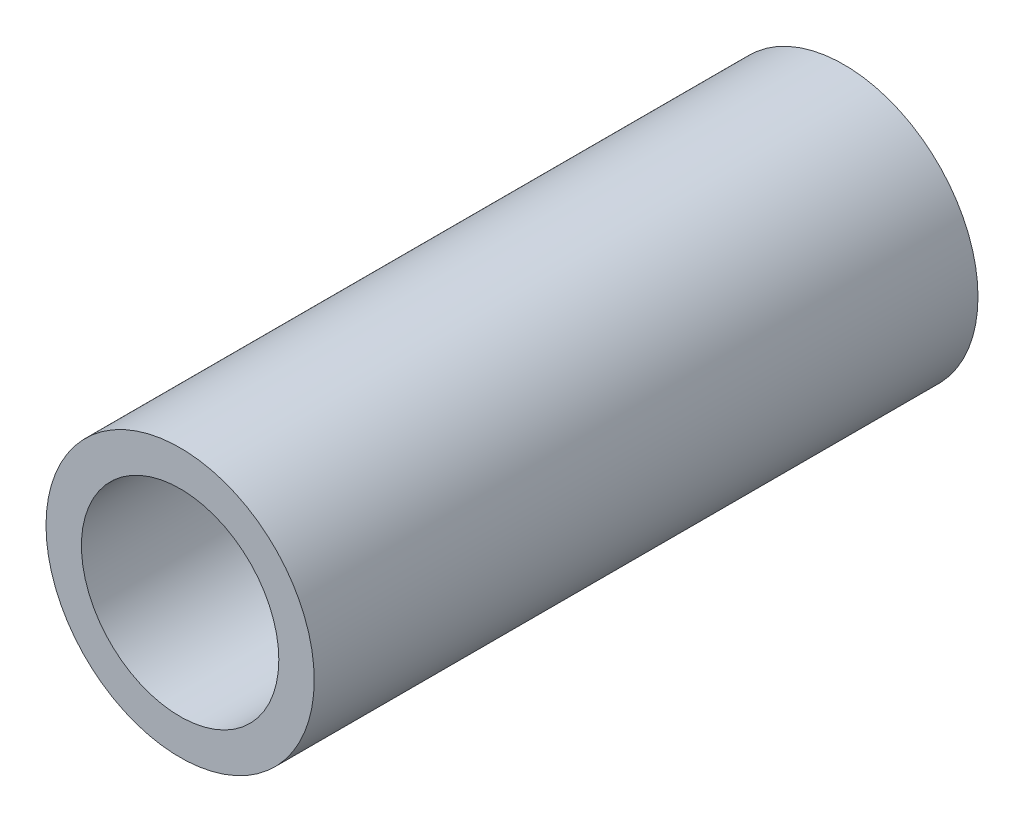
ISO-10303-21;
HEADER;
FILE_DESCRIPTION(('STEP AP214'),'2;1');
FILE_NAME('part.step','',(''),(''),'','','');
FILE_SCHEMA(('AUTOMOTIVE_DESIGN { 1 0 10303 214 1 1 1 1 }'));
ENDSEC;
DATA;
#1=APPLICATION_CONTEXT('core data for automotive mechanical design processes');
#2=APPLICATION_PROTOCOL_DEFINITION('international standard','automotive_design',2000,#1);
#3=PRODUCT_CONTEXT('',#1,'mechanical');
#4=PRODUCT('Part','Part','',(#3));
#5=PRODUCT_RELATED_PRODUCT_CATEGORY('part','',(#4));
#6=PRODUCT_DEFINITION_FORMATION('','',#4);
#7=PRODUCT_DEFINITION_CONTEXT('part definition',#1,'design');
#8=PRODUCT_DEFINITION('design','',#6,#7);
#9=PRODUCT_DEFINITION_SHAPE('','',#8);
#10=(LENGTH_UNIT() NAMED_UNIT(*) SI_UNIT(.MILLI.,.METRE.));
#11=(NAMED_UNIT(*) PLANE_ANGLE_UNIT() SI_UNIT($,.RADIAN.));
#12=(NAMED_UNIT(*) SI_UNIT($,.STERADIAN.) SOLID_ANGLE_UNIT());
#13=UNCERTAINTY_MEASURE_WITH_UNIT(LENGTH_MEASURE(1.E-05),#10,'distance_accuracy_value','');
#14=(GEOMETRIC_REPRESENTATION_CONTEXT(3) GLOBAL_UNCERTAINTY_ASSIGNED_CONTEXT((#13)) GLOBAL_UNIT_ASSIGNED_CONTEXT((#10,
#11,#12)) REPRESENTATION_CONTEXT('',''));
#15=CARTESIAN_POINT('',(0.,0.,0.));
#16=DIRECTION('',(0.,0.,1.));
#17=DIRECTION('',(1.,0.,0.));
#18=AXIS2_PLACEMENT_3D('',#15,#16,#17);
#19=CARTESIAN_POINT('',(0.,0.,43.2154482118713));
#20=DIRECTION('',(0.,0.,-1.));
#21=DIRECTION('',(-1.,0.,0.));
#22=AXIS2_PLACEMENT_3D('',#19,#20,#21);
#23=CYLINDRICAL_SURFACE('',#22,5.55625);
#24=CARTESIAN_POINT('',(0.,0.,0.));
#25=DIRECTION('',(0.,0.,1.));
#26=DIRECTION('',(1.,0.,0.));
#27=AXIS2_PLACEMENT_3D('',#24,#25,#26);
#28=CIRCLE('',#27,5.55625);
#29=CARTESIAN_POINT('',(5.55625,0.,0.));
#30=VERTEX_POINT('',#29);
#31=EDGE_CURVE('E41',#30,#30,#28,.T.);
#32=ORIENTED_EDGE('',*,*,#31,.T.);
#33=EDGE_LOOP('',(#32));
#34=FACE_BOUND('',#33,.T.);
#35=CARTESIAN_POINT('',(0.,0.,27.5000000000002));
#36=DIRECTION('',(0.,0.,1.));
#37=DIRECTION('',(1.,0.,0.));
#38=AXIS2_PLACEMENT_3D('',#35,#36,#37);
#39=CIRCLE('',#38,5.55625);
#40=CARTESIAN_POINT('',(5.55625,0.,27.5000000000002));
#41=VERTEX_POINT('',#40);
#42=EDGE_CURVE('E10',#41,#41,#39,.T.);
#43=ORIENTED_EDGE('',*,*,#42,.F.);
#44=EDGE_LOOP('',(#43));
#45=FACE_BOUND('',#44,.T.);
#46=ADVANCED_FACE('F30',(#34,#45),#23,.T.);
#47=CARTESIAN_POINT('',(0.,0.,0.));
#48=DIRECTION('',(0.,0.,1.));
#49=DIRECTION('',(1.,0.,0.));
#50=AXIS2_PLACEMENT_3D('',#47,#48,#49);
#51=PLANE('',#50);
#52=ORIENTED_EDGE('',*,*,#31,.F.);
#53=EDGE_LOOP('',(#52));
#54=FACE_BOUND('',#53,.T.);
#55=CARTESIAN_POINT('',(0.,0.,0.));
#56=DIRECTION('',(0.,0.,1.));
#57=DIRECTION('',(1.,0.,0.));
#58=AXIS2_PLACEMENT_3D('',#55,#56,#57);
#59=CIRCLE('',#58,4.0894);
#60=CARTESIAN_POINT('',(4.0894,0.,0.));
#61=VERTEX_POINT('',#60);
#62=EDGE_CURVE('E43',#61,#61,#59,.T.);
#63=ORIENTED_EDGE('',*,*,#62,.T.);
#64=EDGE_LOOP('',(#63));
#65=FACE_BOUND('',#64,.T.);
#66=ADVANCED_FACE('F50',(#54,#65),#51,.F.);
#67=CARTESIAN_POINT('',(0.,0.,43.2154482118713));
#68=DIRECTION('',(0.,0.,-1.));
#69=DIRECTION('',(-1.,0.,0.));
#70=AXIS2_PLACEMENT_3D('',#67,#68,#69);
#71=CYLINDRICAL_SURFACE('',#70,4.0894);
#72=ORIENTED_EDGE('',*,*,#62,.F.);
#73=EDGE_LOOP('',(#72));
#74=FACE_BOUND('',#73,.T.);
#75=CARTESIAN_POINT('',(0.,0.,27.5000000000002));
#76=DIRECTION('',(0.,0.,1.));
#77=DIRECTION('',(1.,0.,0.));
#78=AXIS2_PLACEMENT_3D('',#75,#76,#77);
#79=CIRCLE('',#78,4.0894);
#80=CARTESIAN_POINT('',(4.0894,0.,27.5000000000002));
#81=VERTEX_POINT('',#80);
#82=EDGE_CURVE('E33',#81,#81,#79,.T.);
#83=ORIENTED_EDGE('',*,*,#82,.T.);
#84=EDGE_LOOP('',(#83));
#85=FACE_BOUND('',#84,.T.);
#86=ADVANCED_FACE('F53',(#74,#85),#71,.F.);
#87=CARTESIAN_POINT('',(5.87999999999999,4.25270103555652E-09,27.5000000000002));
#88=DIRECTION('',(0.,0.,1.));
#89=DIRECTION('',(1.,7.23313281956604E-10,0.));
#90=AXIS2_PLACEMENT_3D('',#87,#88,#89);
#91=PLANE('',#90);
#92=ORIENTED_EDGE('',*,*,#82,.F.);
#93=EDGE_LOOP('',(#92));
#94=FACE_BOUND('',#93,.T.);
#95=ORIENTED_EDGE('',*,*,#42,.T.);
#96=EDGE_LOOP('',(#95));
#97=FACE_BOUND('',#96,.T.);
#98=ADVANCED_FACE('F58',(#94,#97),#91,.T.);
#99=CLOSED_SHELL('',(#46,#66,#86,#98));
#100=MANIFOLD_SOLID_BREP('B2',#99);
#101=ADVANCED_BREP_SHAPE_REPRESENTATION('',(#18,#100),#14);
#102=SHAPE_DEFINITION_REPRESENTATION(#9,#101);
ENDSEC;
END-ISO-10303-21;
